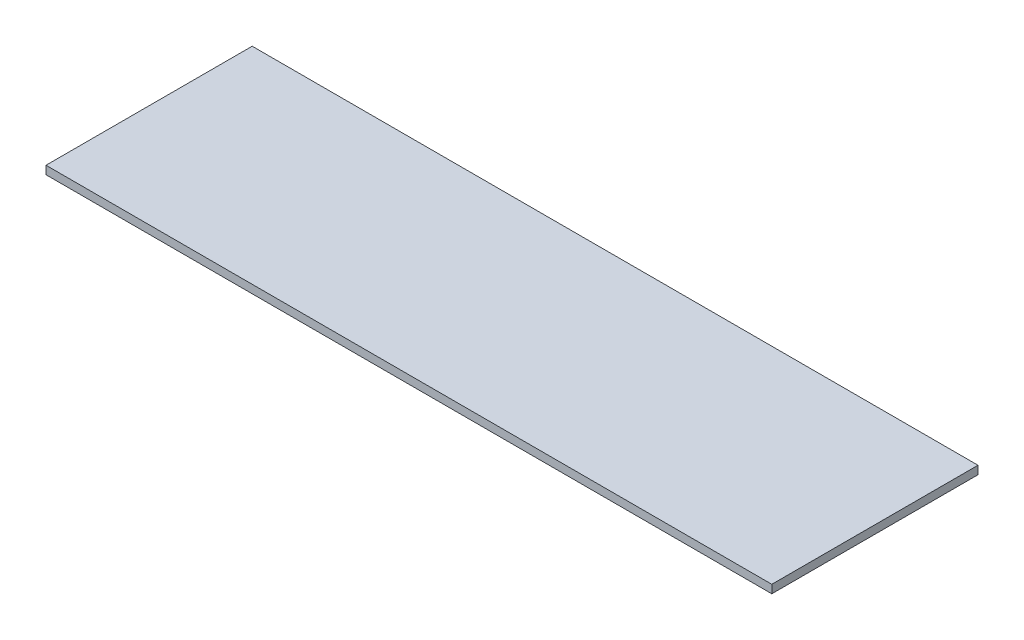
ISO-10303-21;
HEADER;
FILE_DESCRIPTION(('STEP AP214'),'2;1');
FILE_NAME('part.step','',(''),(''),'','','');
FILE_SCHEMA(('AUTOMOTIVE_DESIGN { 1 0 10303 214 1 1 1 1 }'));
ENDSEC;
DATA;
#1=APPLICATION_CONTEXT('core data for automotive mechanical design processes');
#2=APPLICATION_PROTOCOL_DEFINITION('international standard','automotive_design',2000,#1);
#3=PRODUCT_CONTEXT('',#1,'mechanical');
#4=PRODUCT('Part','Part','',(#3));
#5=PRODUCT_RELATED_PRODUCT_CATEGORY('part','',(#4));
#6=PRODUCT_DEFINITION_FORMATION('','',#4);
#7=PRODUCT_DEFINITION_CONTEXT('part definition',#1,'design');
#8=PRODUCT_DEFINITION('design','',#6,#7);
#9=PRODUCT_DEFINITION_SHAPE('','',#8);
#10=(LENGTH_UNIT() NAMED_UNIT(*) SI_UNIT(.MILLI.,.METRE.));
#11=(NAMED_UNIT(*) PLANE_ANGLE_UNIT() SI_UNIT($,.RADIAN.));
#12=(NAMED_UNIT(*) SI_UNIT($,.STERADIAN.) SOLID_ANGLE_UNIT());
#13=UNCERTAINTY_MEASURE_WITH_UNIT(LENGTH_MEASURE(1.E-05),#10,'distance_accuracy_value','');
#14=(GEOMETRIC_REPRESENTATION_CONTEXT(3) GLOBAL_UNCERTAINTY_ASSIGNED_CONTEXT((#13)) GLOBAL_UNIT_ASSIGNED_CONTEXT((#10,
#11,#12)) REPRESENTATION_CONTEXT('',''));
#15=CARTESIAN_POINT('',(0.,0.,0.));
#16=DIRECTION('',(0.,0.,1.));
#17=DIRECTION('',(1.,0.,0.));
#18=AXIS2_PLACEMENT_3D('',#15,#16,#17);
#19=CARTESIAN_POINT('',(-88.,2.,-25.));
#20=DIRECTION('',(1.,0.,0.));
#21=DIRECTION('',(0.,0.,-1.));
#22=AXIS2_PLACEMENT_3D('',#19,#20,#21);
#23=PLANE('',#22);
#24=DIRECTION('',(0.,0.,1.));
#25=VECTOR('',#24,1.);
#26=CARTESIAN_POINT('',(-88.,0.,-25.));
#27=LINE('',#26,#25);
#28=CARTESIAN_POINT('',(-88.,0.,-25.));
#29=VERTEX_POINT('',#28);
#30=CARTESIAN_POINT('',(-88.,0.,25.));
#31=VERTEX_POINT('',#30);
#32=EDGE_CURVE('E105',#29,#31,#27,.T.);
#33=ORIENTED_EDGE('',*,*,#32,.T.);
#34=DIRECTION('',(0.,-1.,0.));
#35=VECTOR('',#34,1.);
#36=CARTESIAN_POINT('',(-88.,2.,25.));
#37=LINE('',#36,#35);
#38=CARTESIAN_POINT('',(-88.,2.,25.));
#39=VERTEX_POINT('',#38);
#40=EDGE_CURVE('E11',#39,#31,#37,.T.);
#41=ORIENTED_EDGE('',*,*,#40,.F.);
#42=DIRECTION('',(0.,0.,1.));
#43=VECTOR('',#42,1.);
#44=CARTESIAN_POINT('',(-88.,2.,-25.));
#45=LINE('',#44,#43);
#46=CARTESIAN_POINT('',(-88.,2.,-25.));
#47=VERTEX_POINT('',#46);
#48=EDGE_CURVE('E93',#47,#39,#45,.T.);
#49=ORIENTED_EDGE('',*,*,#48,.F.);
#50=DIRECTION('',(0.,-1.,0.));
#51=VECTOR('',#50,1.);
#52=CARTESIAN_POINT('',(-88.,2.,-25.));
#53=LINE('',#52,#51);
#54=EDGE_CURVE('E101',#47,#29,#53,.T.);
#55=ORIENTED_EDGE('',*,*,#54,.T.);
#56=EDGE_LOOP('',(#33,#41,#49,#55));
#57=FACE_BOUND('',#56,.T.);
#58=ADVANCED_FACE('F42',(#57),#23,.F.);
#59=CARTESIAN_POINT('',(88.,2.,25.));
#60=DIRECTION('',(0.,0.,-1.));
#61=DIRECTION('',(-1.,0.,0.));
#62=AXIS2_PLACEMENT_3D('',#59,#60,#61);
#63=PLANE('',#62);
#64=DIRECTION('',(1.,0.,0.));
#65=VECTOR('',#64,1.);
#66=CARTESIAN_POINT('',(88.,0.,25.));
#67=LINE('',#66,#65);
#68=CARTESIAN_POINT('',(88.,0.,25.));
#69=VERTEX_POINT('',#68);
#70=EDGE_CURVE('E97',#31,#69,#67,.T.);
#71=ORIENTED_EDGE('',*,*,#70,.T.);
#72=DIRECTION('',(0.,-1.,0.));
#73=VECTOR('',#72,1.);
#74=CARTESIAN_POINT('',(88.,2.,25.));
#75=LINE('',#74,#73);
#76=CARTESIAN_POINT('',(88.,2.,25.));
#77=VERTEX_POINT('',#76);
#78=EDGE_CURVE('E50',#77,#69,#75,.T.);
#79=ORIENTED_EDGE('',*,*,#78,.F.);
#80=DIRECTION('',(1.,0.,0.));
#81=VECTOR('',#80,1.);
#82=CARTESIAN_POINT('',(88.,2.,25.));
#83=LINE('',#82,#81);
#84=EDGE_CURVE('E88',#39,#77,#83,.T.);
#85=ORIENTED_EDGE('',*,*,#84,.F.);
#86=ORIENTED_EDGE('',*,*,#40,.T.);
#87=EDGE_LOOP('',(#71,#79,#85,#86));
#88=FACE_BOUND('',#87,.T.);
#89=ADVANCED_FACE('F96',(#88),#63,.F.);
#90=CARTESIAN_POINT('',(88.,2.,-25.));
#91=DIRECTION('',(-1.,0.,0.));
#92=DIRECTION('',(0.,0.,1.));
#93=AXIS2_PLACEMENT_3D('',#90,#91,#92);
#94=PLANE('',#93);
#95=DIRECTION('',(0.,0.,-1.));
#96=VECTOR('',#95,1.);
#97=CARTESIAN_POINT('',(88.,0.,-25.));
#98=LINE('',#97,#96);
#99=CARTESIAN_POINT('',(88.,0.,-25.));
#100=VERTEX_POINT('',#99);
#101=EDGE_CURVE('E75',#69,#100,#98,.T.);
#102=ORIENTED_EDGE('',*,*,#101,.T.);
#103=DIRECTION('',(0.,-1.,0.));
#104=VECTOR('',#103,1.);
#105=CARTESIAN_POINT('',(88.,2.,-25.));
#106=LINE('',#105,#104);
#107=CARTESIAN_POINT('',(88.,2.,-25.));
#108=VERTEX_POINT('',#107);
#109=EDGE_CURVE('E98',#108,#100,#106,.T.);
#110=ORIENTED_EDGE('',*,*,#109,.F.);
#111=DIRECTION('',(0.,0.,-1.));
#112=VECTOR('',#111,1.);
#113=CARTESIAN_POINT('',(88.,2.,-25.));
#114=LINE('',#113,#112);
#115=EDGE_CURVE('E91',#77,#108,#114,.T.);
#116=ORIENTED_EDGE('',*,*,#115,.F.);
#117=ORIENTED_EDGE('',*,*,#78,.T.);
#118=EDGE_LOOP('',(#102,#110,#116,#117));
#119=FACE_BOUND('',#118,.T.);
#120=ADVANCED_FACE('F99',(#119),#94,.F.);
#121=CARTESIAN_POINT('',(88.,2.,-25.));
#122=DIRECTION('',(0.,0.,1.));
#123=DIRECTION('',(1.,0.,0.));
#124=AXIS2_PLACEMENT_3D('',#121,#122,#123);
#125=PLANE('',#124);
#126=DIRECTION('',(-1.,0.,0.));
#127=VECTOR('',#126,1.);
#128=CARTESIAN_POINT('',(88.,0.,-25.));
#129=LINE('',#128,#127);
#130=EDGE_CURVE('E81',#100,#29,#129,.T.);
#131=ORIENTED_EDGE('',*,*,#130,.T.);
#132=ORIENTED_EDGE('',*,*,#54,.F.);
#133=DIRECTION('',(-1.,0.,0.));
#134=VECTOR('',#133,1.);
#135=CARTESIAN_POINT('',(88.,2.,-25.));
#136=LINE('',#135,#134);
#137=EDGE_CURVE('E58',#108,#47,#136,.T.);
#138=ORIENTED_EDGE('',*,*,#137,.F.);
#139=ORIENTED_EDGE('',*,*,#109,.T.);
#140=EDGE_LOOP('',(#131,#132,#138,#139));
#141=FACE_BOUND('',#140,.T.);
#142=ADVANCED_FACE('F112',(#141),#125,.F.);
#143=CARTESIAN_POINT('',(0.,2.,0.));
#144=DIRECTION('',(0.,-1.,0.));
#145=DIRECTION('',(0.,0.,-1.));
#146=AXIS2_PLACEMENT_3D('',#143,#144,#145);
#147=PLANE('',#146);
#148=ORIENTED_EDGE('',*,*,#48,.T.);
#149=ORIENTED_EDGE('',*,*,#84,.T.);
#150=ORIENTED_EDGE('',*,*,#115,.T.);
#151=ORIENTED_EDGE('',*,*,#137,.T.);
#152=EDGE_LOOP('',(#148,#149,#150,#151));
#153=FACE_BOUND('',#152,.T.);
#154=ADVANCED_FACE('F89',(#153),#147,.F.);
#155=CARTESIAN_POINT('',(0.,0.,0.));
#156=DIRECTION('',(0.,-1.,0.));
#157=DIRECTION('',(0.,0.,-1.));
#158=AXIS2_PLACEMENT_3D('',#155,#156,#157);
#159=PLANE('',#158);
#160=ORIENTED_EDGE('',*,*,#32,.F.);
#161=ORIENTED_EDGE('',*,*,#130,.F.);
#162=ORIENTED_EDGE('',*,*,#101,.F.);
#163=ORIENTED_EDGE('',*,*,#70,.F.);
#164=EDGE_LOOP('',(#160,#161,#162,#163));
#165=FACE_BOUND('',#164,.T.);
#166=ADVANCED_FACE('F115',(#165),#159,.T.);
#167=CLOSED_SHELL('',(#58,#89,#120,#142,#154,#166));
#168=MANIFOLD_SOLID_BREP('B2',#167);
#169=ADVANCED_BREP_SHAPE_REPRESENTATION('',(#18,#168),#14);
#170=SHAPE_DEFINITION_REPRESENTATION(#9,#169);
ENDSEC;
END-ISO-10303-21;
